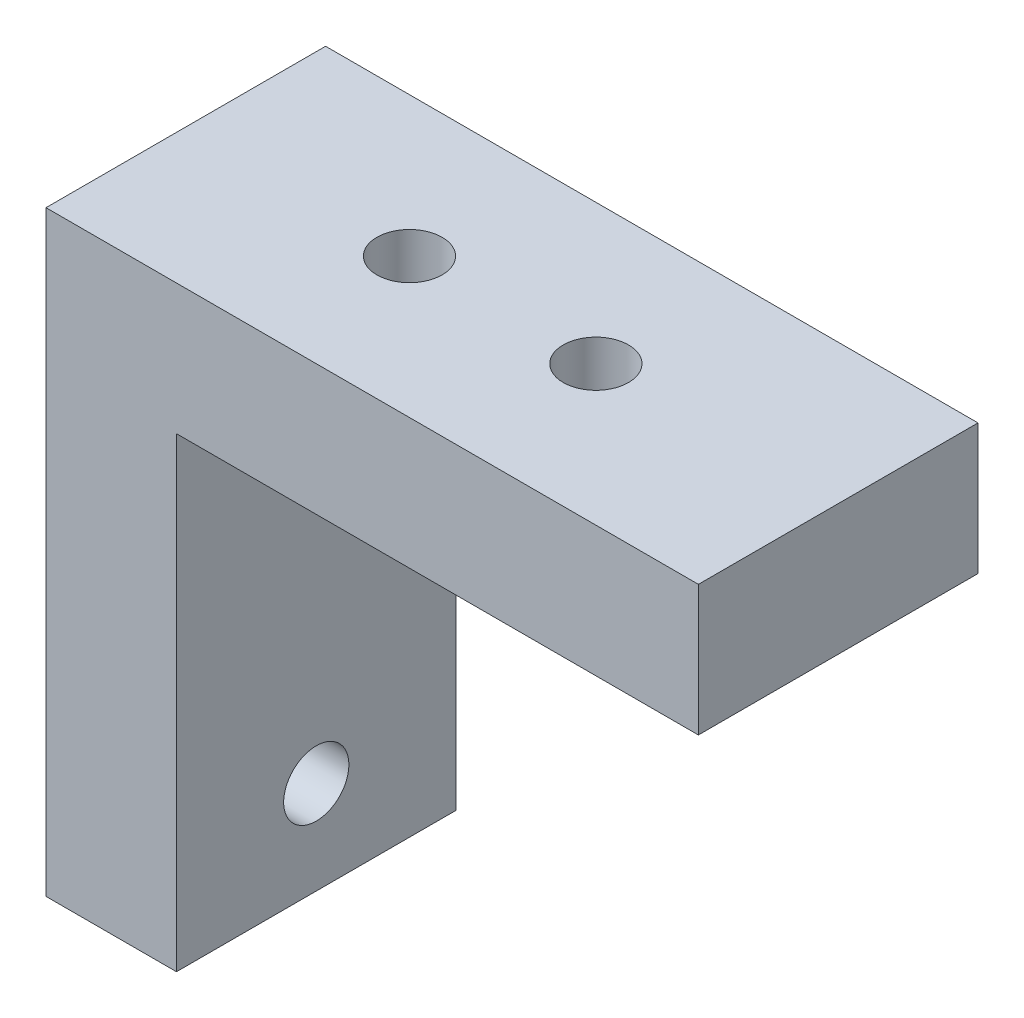
ISO-10303-21;
HEADER;
FILE_DESCRIPTION(('STEP AP214'),'2;1');
FILE_NAME('part.step','',(''),(''),'','','');
FILE_SCHEMA(('AUTOMOTIVE_DESIGN { 1 0 10303 214 1 1 1 1 }'));
ENDSEC;
DATA;
#1=APPLICATION_CONTEXT('core data for automotive mechanical design processes');
#2=APPLICATION_PROTOCOL_DEFINITION('international standard','automotive_design',2000,#1);
#3=PRODUCT_CONTEXT('',#1,'mechanical');
#4=PRODUCT('Part','Part','',(#3));
#5=PRODUCT_RELATED_PRODUCT_CATEGORY('part','',(#4));
#6=PRODUCT_DEFINITION_FORMATION('','',#4);
#7=PRODUCT_DEFINITION_CONTEXT('part definition',#1,'design');
#8=PRODUCT_DEFINITION('design','',#6,#7);
#9=PRODUCT_DEFINITION_SHAPE('','',#8);
#10=(LENGTH_UNIT() NAMED_UNIT(*) SI_UNIT(.MILLI.,.METRE.));
#11=(NAMED_UNIT(*) PLANE_ANGLE_UNIT() SI_UNIT($,.RADIAN.));
#12=(NAMED_UNIT(*) SI_UNIT($,.STERADIAN.) SOLID_ANGLE_UNIT());
#13=UNCERTAINTY_MEASURE_WITH_UNIT(LENGTH_MEASURE(1.E-05),#10,'distance_accuracy_value','');
#14=(GEOMETRIC_REPRESENTATION_CONTEXT(3) GLOBAL_UNCERTAINTY_ASSIGNED_CONTEXT((#13)) GLOBAL_UNIT_ASSIGNED_CONTEXT((#10,
#11,#12)) REPRESENTATION_CONTEXT('',''));
#15=CARTESIAN_POINT('',(0.,0.,0.));
#16=DIRECTION('',(0.,0.,1.));
#17=DIRECTION('',(1.,0.,0.));
#18=AXIS2_PLACEMENT_3D('',#15,#16,#17);
#19=CARTESIAN_POINT('',(7.,-15.7047237110813,4.64763814445934));
#20=DIRECTION('',(0.,0.,-1.));
#21=DIRECTION('',(-1.,0.,0.));
#22=AXIS2_PLACEMENT_3D('',#19,#20,#21);
#23=PLANE('',#22);
#24=DIRECTION('',(0.,-1.,0.));
#25=VECTOR('',#24,1.);
#26=CARTESIAN_POINT('',(0.,-15.7047237110813,4.64763814445934));
#27=LINE('',#26,#25);
#28=CARTESIAN_POINT('',(0.,16.2952762889187,4.64763814445934));
#29=VERTEX_POINT('',#28);
#30=CARTESIAN_POINT('',(0.,-15.7047237110813,4.64763814445934));
#31=VERTEX_POINT('',#30);
#32=EDGE_CURVE('E97',#29,#31,#27,.T.);
#33=ORIENTED_EDGE('',*,*,#32,.T.);
#34=DIRECTION('',(-1.,0.,0.));
#35=VECTOR('',#34,1.);
#36=CARTESIAN_POINT('',(7.,-15.7047237110813,4.64763814445934));
#37=LINE('',#36,#35);
#38=CARTESIAN_POINT('',(7.,-15.7047237110813,4.64763814445934));
#39=VERTEX_POINT('',#38);
#40=EDGE_CURVE('E11',#39,#31,#37,.T.);
#41=ORIENTED_EDGE('',*,*,#40,.F.);
#42=DIRECTION('',(0.,-1.,0.));
#43=VECTOR('',#42,1.);
#44=CARTESIAN_POINT('',(7.,-15.7047237110813,4.64763814445934));
#45=LINE('',#44,#43);
#46=CARTESIAN_POINT('',(7.,9.2952762889187,4.64763814445934));
#47=VERTEX_POINT('',#46);
#48=EDGE_CURVE('E89',#47,#39,#45,.T.);
#49=ORIENTED_EDGE('',*,*,#48,.F.);
#50=DIRECTION('',(1.,0.,0.));
#51=VECTOR('',#50,1.);
#52=CARTESIAN_POINT('',(0.,9.2952762889187,4.64763814445934));
#53=LINE('',#52,#51);
#54=CARTESIAN_POINT('',(35.,9.2952762889187,4.64763814445934));
#55=VERTEX_POINT('',#54);
#56=EDGE_CURVE('E51',#47,#55,#53,.T.);
#57=ORIENTED_EDGE('',*,*,#56,.T.);
#58=DIRECTION('',(0.,-1.,0.));
#59=VECTOR('',#58,1.);
#60=CARTESIAN_POINT('',(35.,16.2952762889187,4.64763814445934));
#61=LINE('',#60,#59);
#62=CARTESIAN_POINT('',(35.,16.2952762889187,4.64763814445934));
#63=VERTEX_POINT('',#62);
#64=EDGE_CURVE('E133',#63,#55,#61,.T.);
#65=ORIENTED_EDGE('',*,*,#64,.F.);
#66=DIRECTION('',(1.,0.,0.));
#67=VECTOR('',#66,1.);
#68=CARTESIAN_POINT('',(0.,16.2952762889187,4.64763814445934));
#69=LINE('',#68,#67);
#70=EDGE_CURVE('E101',#29,#63,#69,.T.);
#71=ORIENTED_EDGE('',*,*,#70,.F.);
#72=EDGE_LOOP('',(#33,#41,#49,#57,#65,#71));
#73=FACE_BOUND('',#72,.T.);
#74=ADVANCED_FACE('F33',(#73),#23,.F.);
#75=CARTESIAN_POINT('',(7.,-15.7047237110813,4.64763814445934));
#76=DIRECTION('',(0.,1.,0.));
#77=DIRECTION('',(0.,0.,1.));
#78=AXIS2_PLACEMENT_3D('',#75,#76,#77);
#79=PLANE('',#78);
#80=DIRECTION('',(0.,0.,-1.));
#81=VECTOR('',#80,1.);
#82=CARTESIAN_POINT('',(0.,-15.7047237110813,4.64763814445934));
#83=LINE('',#82,#81);
#84=CARTESIAN_POINT('',(0.,-15.7047237110813,-10.3523618555407));
#85=VERTEX_POINT('',#84);
#86=EDGE_CURVE('E64',#31,#85,#83,.T.);
#87=ORIENTED_EDGE('',*,*,#86,.T.);
#88=DIRECTION('',(-1.,0.,0.));
#89=VECTOR('',#88,1.);
#90=CARTESIAN_POINT('',(7.,-15.7047237110813,-10.3523618555407));
#91=LINE('',#90,#89);
#92=CARTESIAN_POINT('',(7.,-15.7047237110813,-10.3523618555407));
#93=VERTEX_POINT('',#92);
#94=EDGE_CURVE('E42',#93,#85,#91,.T.);
#95=ORIENTED_EDGE('',*,*,#94,.F.);
#96=DIRECTION('',(0.,0.,-1.));
#97=VECTOR('',#96,1.);
#98=CARTESIAN_POINT('',(7.,-15.7047237110813,4.64763814445934));
#99=LINE('',#98,#97);
#100=EDGE_CURVE('E79',#39,#93,#99,.T.);
#101=ORIENTED_EDGE('',*,*,#100,.F.);
#102=ORIENTED_EDGE('',*,*,#40,.T.);
#103=EDGE_LOOP('',(#87,#95,#101,#102));
#104=FACE_BOUND('',#103,.T.);
#105=ADVANCED_FACE('F81',(#104),#79,.F.);
#106=CARTESIAN_POINT('',(7.,-15.7047237110813,-10.3523618555407));
#107=DIRECTION('',(0.,0.,1.));
#108=DIRECTION('',(1.,0.,0.));
#109=AXIS2_PLACEMENT_3D('',#106,#107,#108);
#110=PLANE('',#109);
#111=DIRECTION('',(0.,1.,0.));
#112=VECTOR('',#111,1.);
#113=CARTESIAN_POINT('',(0.,-15.7047237110813,-10.3523618555407));
#114=LINE('',#113,#112);
#115=CARTESIAN_POINT('',(0.,16.2952762889187,-10.3523618555407));
#116=VERTEX_POINT('',#115);
#117=EDGE_CURVE('E94',#85,#116,#114,.T.);
#118=ORIENTED_EDGE('',*,*,#117,.T.);
#119=DIRECTION('',(-1.,0.,0.));
#120=VECTOR('',#119,1.);
#121=CARTESIAN_POINT('',(0.,16.2952762889187,-10.3523618555407));
#122=LINE('',#121,#120);
#123=CARTESIAN_POINT('',(35.,16.2952762889187,-10.3523618555407));
#124=VERTEX_POINT('',#123);
#125=EDGE_CURVE('E138',#124,#116,#122,.T.);
#126=ORIENTED_EDGE('',*,*,#125,.F.);
#127=DIRECTION('',(0.,-1.,0.));
#128=VECTOR('',#127,1.);
#129=CARTESIAN_POINT('',(35.,16.2952762889187,-10.3523618555407));
#130=LINE('',#129,#128);
#131=CARTESIAN_POINT('',(35.,9.2952762889187,-10.3523618555407));
#132=VERTEX_POINT('',#131);
#133=EDGE_CURVE('E123',#124,#132,#130,.T.);
#134=ORIENTED_EDGE('',*,*,#133,.T.);
#135=DIRECTION('',(-1.,0.,0.));
#136=VECTOR('',#135,1.);
#137=CARTESIAN_POINT('',(0.,9.2952762889187,-10.3523618555407));
#138=LINE('',#137,#136);
#139=CARTESIAN_POINT('',(7.,9.2952762889187,-10.3523618555407));
#140=VERTEX_POINT('',#139);
#141=EDGE_CURVE('E120',#132,#140,#138,.T.);
#142=ORIENTED_EDGE('',*,*,#141,.T.);
#143=DIRECTION('',(0.,1.,0.));
#144=VECTOR('',#143,1.);
#145=CARTESIAN_POINT('',(7.,-15.7047237110813,-10.3523618555407));
#146=LINE('',#145,#144);
#147=EDGE_CURVE('E88',#93,#140,#146,.T.);
#148=ORIENTED_EDGE('',*,*,#147,.F.);
#149=ORIENTED_EDGE('',*,*,#94,.T.);
#150=EDGE_LOOP('',(#118,#126,#134,#142,#148,#149));
#151=FACE_BOUND('',#150,.T.);
#152=ADVANCED_FACE('F118',(#151),#110,.F.);
#153=CARTESIAN_POINT('',(7.,0.,0.));
#154=DIRECTION('',(-1.,0.,0.));
#155=DIRECTION('',(0.,0.,1.));
#156=AXIS2_PLACEMENT_3D('',#153,#154,#155);
#157=PLANE('',#156);
#158=CARTESIAN_POINT('',(7.,4.2952762889187,-2.85236185554066));
#159=DIRECTION('',(1.,0.,0.));
#160=DIRECTION('',(0.,0.,-1.));
#161=AXIS2_PLACEMENT_3D('',#158,#159,#160);
#162=CIRCLE('',#161,1.75);
#163=CARTESIAN_POINT('',(7.,4.2952762889187,-4.60236185554066));
#164=VERTEX_POINT('',#163);
#165=EDGE_CURVE('E140',#164,#164,#162,.T.);
#166=ORIENTED_EDGE('',*,*,#165,.F.);
#167=EDGE_LOOP('',(#166));
#168=FACE_BOUND('',#167,.T.);
#169=CARTESIAN_POINT('',(7.,-10.7047237110813,-2.85236185554066));
#170=DIRECTION('',(1.,0.,0.));
#171=DIRECTION('',(0.,0.,-1.));
#172=AXIS2_PLACEMENT_3D('',#169,#170,#171);
#173=CIRCLE('',#172,1.75);
#174=CARTESIAN_POINT('',(7.,-10.7047237110813,-4.60236185554066));
#175=VERTEX_POINT('',#174);
#176=EDGE_CURVE('E108',#175,#175,#173,.T.);
#177=ORIENTED_EDGE('',*,*,#176,.F.);
#178=EDGE_LOOP('',(#177));
#179=FACE_BOUND('',#178,.T.);
#180=ORIENTED_EDGE('',*,*,#48,.T.);
#181=ORIENTED_EDGE('',*,*,#100,.T.);
#182=ORIENTED_EDGE('',*,*,#147,.T.);
#183=DIRECTION('',(0.,0.,1.));
#184=VECTOR('',#183,1.);
#185=CARTESIAN_POINT('',(7.,9.2952762889187,4.64763814445934));
#186=LINE('',#185,#184);
#187=EDGE_CURVE('E68',#140,#47,#186,.T.);
#188=ORIENTED_EDGE('',*,*,#187,.T.);
#189=EDGE_LOOP('',(#180,#181,#182,#188));
#190=FACE_BOUND('',#189,.T.);
#191=ADVANCED_FACE('F92',(#168,#179,#190),#157,.F.);
#192=CARTESIAN_POINT('',(0.,0.,0.));
#193=DIRECTION('',(-1.,0.,0.));
#194=DIRECTION('',(0.,0.,1.));
#195=AXIS2_PLACEMENT_3D('',#192,#193,#194);
#196=PLANE('',#195);
#197=CARTESIAN_POINT('',(0.,4.2952762889187,-2.85236185554066));
#198=DIRECTION('',(1.,0.,0.));
#199=DIRECTION('',(0.,0.,-1.));
#200=AXIS2_PLACEMENT_3D('',#197,#198,#199);
#201=CIRCLE('',#200,1.75);
#202=CARTESIAN_POINT('',(0.,4.2952762889187,-4.60236185554066));
#203=VERTEX_POINT('',#202);
#204=EDGE_CURVE('E219',#203,#203,#201,.T.);
#205=ORIENTED_EDGE('',*,*,#204,.T.);
#206=EDGE_LOOP('',(#205));
#207=FACE_BOUND('',#206,.T.);
#208=CARTESIAN_POINT('',(0.,-10.7047237110813,-2.85236185554066));
#209=DIRECTION('',(1.,0.,0.));
#210=DIRECTION('',(0.,0.,-1.));
#211=AXIS2_PLACEMENT_3D('',#208,#209,#210);
#212=CIRCLE('',#211,1.75);
#213=CARTESIAN_POINT('',(0.,-10.7047237110813,-4.60236185554066));
#214=VERTEX_POINT('',#213);
#215=EDGE_CURVE('E104',#214,#214,#212,.T.);
#216=ORIENTED_EDGE('',*,*,#215,.T.);
#217=EDGE_LOOP('',(#216));
#218=FACE_BOUND('',#217,.T.);
#219=ORIENTED_EDGE('',*,*,#32,.F.);
#220=DIRECTION('',(0.,0.,1.));
#221=VECTOR('',#220,1.);
#222=CARTESIAN_POINT('',(0.,16.2952762889187,4.64763814445934));
#223=LINE('',#222,#221);
#224=EDGE_CURVE('E124',#116,#29,#223,.T.);
#225=ORIENTED_EDGE('',*,*,#224,.F.);
#226=ORIENTED_EDGE('',*,*,#117,.F.);
#227=ORIENTED_EDGE('',*,*,#86,.F.);
#228=EDGE_LOOP('',(#219,#225,#226,#227));
#229=FACE_BOUND('',#228,.T.);
#230=ADVANCED_FACE('F174',(#207,#218,#229),#196,.T.);
#231=CARTESIAN_POINT('',(0.,-10.7047237110813,-2.85236185554066));
#232=DIRECTION('',(1.,0.,0.));
#233=DIRECTION('',(0.,0.,-1.));
#234=AXIS2_PLACEMENT_3D('',#231,#232,#233);
#235=CYLINDRICAL_SURFACE('',#234,1.75);
#236=ORIENTED_EDGE('',*,*,#215,.F.);
#237=EDGE_LOOP('',(#236));
#238=FACE_BOUND('',#237,.T.);
#239=ORIENTED_EDGE('',*,*,#176,.T.);
#240=EDGE_LOOP('',(#239));
#241=FACE_BOUND('',#240,.T.);
#242=ADVANCED_FACE('F190',(#238,#241),#235,.F.);
#243=CARTESIAN_POINT('',(0.,4.2952762889187,-2.85236185554066));
#244=DIRECTION('',(1.,0.,0.));
#245=DIRECTION('',(0.,0.,-1.));
#246=AXIS2_PLACEMENT_3D('',#243,#244,#245);
#247=CYLINDRICAL_SURFACE('',#246,1.75);
#248=ORIENTED_EDGE('',*,*,#204,.F.);
#249=EDGE_LOOP('',(#248));
#250=FACE_BOUND('',#249,.T.);
#251=ORIENTED_EDGE('',*,*,#165,.T.);
#252=EDGE_LOOP('',(#251));
#253=FACE_BOUND('',#252,.T.);
#254=ADVANCED_FACE('F182',(#250,#253),#247,.F.);
#255=CARTESIAN_POINT('',(0.,9.2952762889187,0.));
#256=DIRECTION('',(0.,-1.,0.));
#257=DIRECTION('',(0.,0.,-1.));
#258=AXIS2_PLACEMENT_3D('',#255,#256,#257);
#259=PLANE('',#258);
#260=CARTESIAN_POINT('',(22.,9.2952762889187,-2.85236185554066));
#261=DIRECTION('',(0.,-1.,0.));
#262=DIRECTION('',(0.,0.,-1.));
#263=AXIS2_PLACEMENT_3D('',#260,#261,#262);
#264=CIRCLE('',#263,1.75);
#265=CARTESIAN_POINT('',(22.,9.2952762889187,-4.60236185554066));
#266=VERTEX_POINT('',#265);
#267=EDGE_CURVE('E156',#266,#266,#264,.T.);
#268=ORIENTED_EDGE('',*,*,#267,.F.);
#269=EDGE_LOOP('',(#268));
#270=FACE_BOUND('',#269,.T.);
#271=CARTESIAN_POINT('',(12.,9.2952762889187,-2.85236185554066));
#272=DIRECTION('',(0.,-1.,0.));
#273=DIRECTION('',(0.,0.,-1.));
#274=AXIS2_PLACEMENT_3D('',#271,#272,#273);
#275=CIRCLE('',#274,1.75);
#276=CARTESIAN_POINT('',(12.,9.2952762889187,-4.60236185554066));
#277=VERTEX_POINT('',#276);
#278=EDGE_CURVE('E150',#277,#277,#275,.T.);
#279=ORIENTED_EDGE('',*,*,#278,.F.);
#280=EDGE_LOOP('',(#279));
#281=FACE_BOUND('',#280,.T.);
#282=ORIENTED_EDGE('',*,*,#187,.F.);
#283=ORIENTED_EDGE('',*,*,#141,.F.);
#284=DIRECTION('',(0.,0.,-1.));
#285=VECTOR('',#284,1.);
#286=CARTESIAN_POINT('',(35.,9.2952762889187,4.64763814445934));
#287=LINE('',#286,#285);
#288=EDGE_CURVE('E125',#55,#132,#287,.T.);
#289=ORIENTED_EDGE('',*,*,#288,.F.);
#290=ORIENTED_EDGE('',*,*,#56,.F.);
#291=EDGE_LOOP('',(#282,#283,#289,#290));
#292=FACE_BOUND('',#291,.T.);
#293=ADVANCED_FACE('F180',(#270,#281,#292),#259,.T.);
#294=CARTESIAN_POINT('',(35.,16.2952762889187,4.64763814445934));
#295=DIRECTION('',(-1.,0.,0.));
#296=DIRECTION('',(0.,0.,1.));
#297=AXIS2_PLACEMENT_3D('',#294,#295,#296);
#298=PLANE('',#297);
#299=ORIENTED_EDGE('',*,*,#288,.T.);
#300=ORIENTED_EDGE('',*,*,#133,.F.);
#301=DIRECTION('',(0.,0.,-1.));
#302=VECTOR('',#301,1.);
#303=CARTESIAN_POINT('',(35.,16.2952762889187,4.64763814445934));
#304=LINE('',#303,#302);
#305=EDGE_CURVE('E142',#63,#124,#304,.T.);
#306=ORIENTED_EDGE('',*,*,#305,.F.);
#307=ORIENTED_EDGE('',*,*,#64,.T.);
#308=EDGE_LOOP('',(#299,#300,#306,#307));
#309=FACE_BOUND('',#308,.T.);
#310=ADVANCED_FACE('F169',(#309),#298,.F.);
#311=CARTESIAN_POINT('',(0.,16.2952762889187,0.));
#312=DIRECTION('',(0.,-1.,0.));
#313=DIRECTION('',(0.,0.,-1.));
#314=AXIS2_PLACEMENT_3D('',#311,#312,#313);
#315=PLANE('',#314);
#316=CARTESIAN_POINT('',(22.,16.2952762889187,-2.85236185554066));
#317=DIRECTION('',(0.,1.,0.));
#318=DIRECTION('',(0.,0.,1.));
#319=AXIS2_PLACEMENT_3D('',#316,#317,#318);
#320=CIRCLE('',#319,1.75);
#321=CARTESIAN_POINT('',(22.,16.2952762889187,-1.10236185554066));
#322=VERTEX_POINT('',#321);
#323=EDGE_CURVE('E159',#322,#322,#320,.T.);
#324=ORIENTED_EDGE('',*,*,#323,.F.);
#325=EDGE_LOOP('',(#324));
#326=FACE_BOUND('',#325,.T.);
#327=CARTESIAN_POINT('',(12.,16.2952762889187,-2.85236185554066));
#328=DIRECTION('',(0.,1.,0.));
#329=DIRECTION('',(0.,0.,1.));
#330=AXIS2_PLACEMENT_3D('',#327,#328,#329);
#331=CIRCLE('',#330,1.75);
#332=CARTESIAN_POINT('',(12.,16.2952762889187,-1.10236185554066));
#333=VERTEX_POINT('',#332);
#334=EDGE_CURVE('E153',#333,#333,#331,.T.);
#335=ORIENTED_EDGE('',*,*,#334,.F.);
#336=EDGE_LOOP('',(#335));
#337=FACE_BOUND('',#336,.T.);
#338=ORIENTED_EDGE('',*,*,#224,.T.);
#339=ORIENTED_EDGE('',*,*,#70,.T.);
#340=ORIENTED_EDGE('',*,*,#305,.T.);
#341=ORIENTED_EDGE('',*,*,#125,.T.);
#342=EDGE_LOOP('',(#338,#339,#340,#341));
#343=FACE_BOUND('',#342,.T.);
#344=ADVANCED_FACE('F165',(#326,#337,#343),#315,.F.);
#345=CARTESIAN_POINT('',(12.,-15.7047487110813,-2.85236185554066));
#346=DIRECTION('',(0.,1.,0.));
#347=DIRECTION('',(0.,0.,1.));
#348=AXIS2_PLACEMENT_3D('',#345,#346,#347);
#349=CYLINDRICAL_SURFACE('',#348,1.75);
#350=ORIENTED_EDGE('',*,*,#278,.T.);
#351=EDGE_LOOP('',(#350));
#352=FACE_BOUND('',#351,.T.);
#353=ORIENTED_EDGE('',*,*,#334,.T.);
#354=EDGE_LOOP('',(#353));
#355=FACE_BOUND('',#354,.T.);
#356=ADVANCED_FACE('F168',(#352,#355),#349,.F.);
#357=CARTESIAN_POINT('',(22.,-15.7047487110813,-2.85236185554066));
#358=DIRECTION('',(0.,1.,0.));
#359=DIRECTION('',(0.,0.,1.));
#360=AXIS2_PLACEMENT_3D('',#357,#358,#359);
#361=CYLINDRICAL_SURFACE('',#360,1.75);
#362=ORIENTED_EDGE('',*,*,#267,.T.);
#363=EDGE_LOOP('',(#362));
#364=FACE_BOUND('',#363,.T.);
#365=ORIENTED_EDGE('',*,*,#323,.T.);
#366=EDGE_LOOP('',(#365));
#367=FACE_BOUND('',#366,.T.);
#368=ADVANCED_FACE('F163',(#364,#367),#361,.F.);
#369=CLOSED_SHELL('',(#74,#105,#152,#191,#230,#242,#254,#293,#310,#344,#356,#368));
#370=MANIFOLD_SOLID_BREP('B2',#369);
#371=ADVANCED_BREP_SHAPE_REPRESENTATION('',(#18,#370),#14);
#372=SHAPE_DEFINITION_REPRESENTATION(#9,#371);
ENDSEC;
END-ISO-10303-21;
